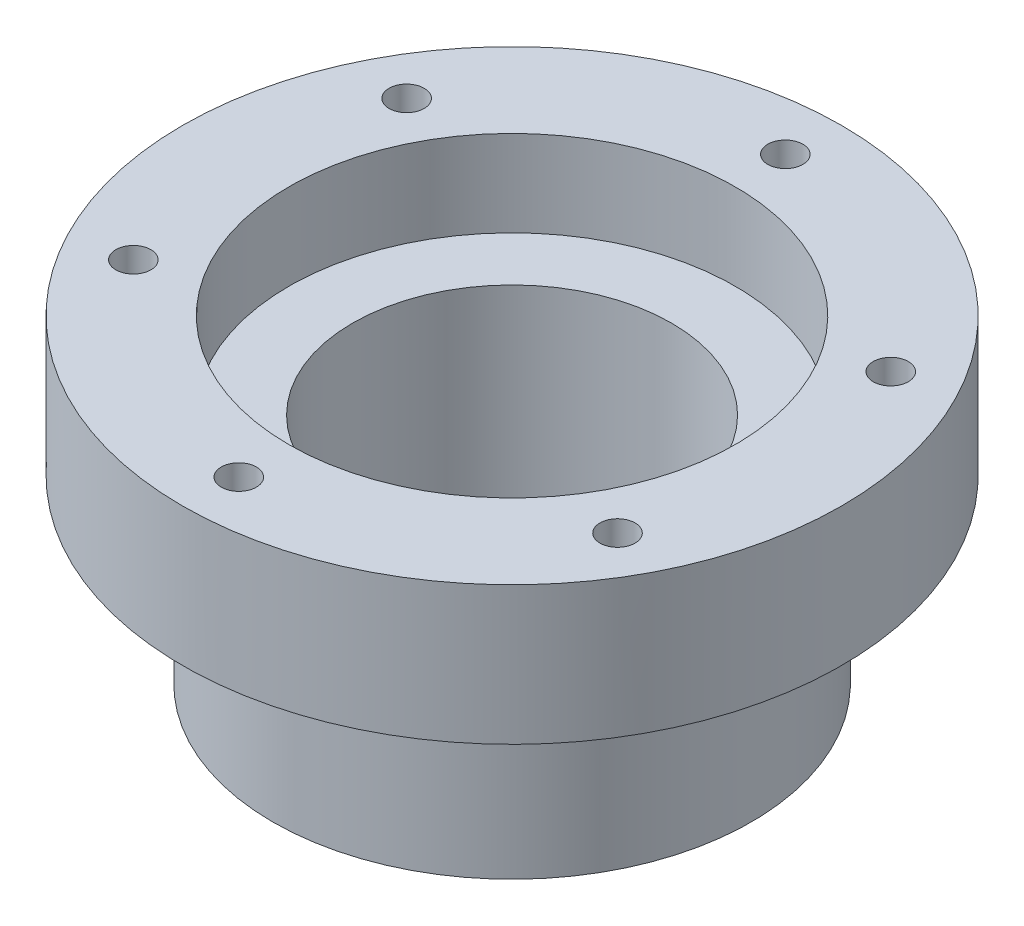
ISO-10303-21;
HEADER;
FILE_DESCRIPTION(('STEP AP214'),'2;1');
FILE_NAME('part.step','',(''),(''),'','','');
FILE_SCHEMA(('AUTOMOTIVE_DESIGN { 1 0 10303 214 1 1 1 1 }'));
ENDSEC;
DATA;
#1=APPLICATION_CONTEXT('core data for automotive mechanical design processes');
#2=APPLICATION_PROTOCOL_DEFINITION('international standard','automotive_design',2000,#1);
#3=PRODUCT_CONTEXT('',#1,'mechanical');
#4=PRODUCT('Part','Part','',(#3));
#5=PRODUCT_RELATED_PRODUCT_CATEGORY('part','',(#4));
#6=PRODUCT_DEFINITION_FORMATION('','',#4);
#7=PRODUCT_DEFINITION_CONTEXT('part definition',#1,'design');
#8=PRODUCT_DEFINITION('design','',#6,#7);
#9=PRODUCT_DEFINITION_SHAPE('','',#8);
#10=(LENGTH_UNIT() NAMED_UNIT(*) SI_UNIT(.MILLI.,.METRE.));
#11=(NAMED_UNIT(*) PLANE_ANGLE_UNIT() SI_UNIT($,.RADIAN.));
#12=(NAMED_UNIT(*) SI_UNIT($,.STERADIAN.) SOLID_ANGLE_UNIT());
#13=UNCERTAINTY_MEASURE_WITH_UNIT(LENGTH_MEASURE(1.E-05),#10,'distance_accuracy_value','');
#14=(GEOMETRIC_REPRESENTATION_CONTEXT(3) GLOBAL_UNCERTAINTY_ASSIGNED_CONTEXT((#13)) GLOBAL_UNIT_ASSIGNED_CONTEXT((#10,
#11,#12)) REPRESENTATION_CONTEXT('',''));
#15=CARTESIAN_POINT('',(0.,0.,0.));
#16=DIRECTION('',(0.,0.,1.));
#17=DIRECTION('',(1.,0.,0.));
#18=AXIS2_PLACEMENT_3D('',#15,#16,#17);
#19=CARTESIAN_POINT('',(0.,30.,0.));
#20=DIRECTION('',(0.,-1.,0.));
#21=DIRECTION('',(0.,0.,-1.));
#22=AXIS2_PLACEMENT_3D('',#19,#20,#21);
#23=CYLINDRICAL_SURFACE('',#22,15.);
#24=CARTESIAN_POINT('',(0.,0.,0.));
#25=DIRECTION('',(0.,-1.,0.));
#26=DIRECTION('',(0.,0.,-1.));
#27=AXIS2_PLACEMENT_3D('',#24,#25,#26);
#28=CIRCLE('',#27,15.);
#29=CARTESIAN_POINT('',(0.,0.,-15.));
#30=VERTEX_POINT('',#29);
#31=EDGE_CURVE('E82',#30,#30,#28,.T.);
#32=ORIENTED_EDGE('',*,*,#31,.T.);
#33=EDGE_LOOP('',(#32));
#34=FACE_BOUND('',#33,.T.);
#35=CARTESIAN_POINT('',(0.,21.9,0.));
#36=DIRECTION('',(0.,1.,0.));
#37=DIRECTION('',(0.,0.,1.));
#38=AXIS2_PLACEMENT_3D('',#35,#36,#37);
#39=CIRCLE('',#38,15.);
#40=CARTESIAN_POINT('',(0.,21.9,15.));
#41=VERTEX_POINT('',#40);
#42=EDGE_CURVE('E80',#41,#41,#39,.F.);
#43=ORIENTED_EDGE('',*,*,#42,.F.);
#44=EDGE_LOOP('',(#43));
#45=FACE_BOUND('',#44,.T.);
#46=ADVANCED_FACE('F41',(#34,#45),#23,.F.);
#47=CARTESIAN_POINT('',(0.,30.,0.));
#48=DIRECTION('',(0.,-1.,0.));
#49=DIRECTION('',(0.,0.,-1.));
#50=AXIS2_PLACEMENT_3D('',#47,#48,#49);
#51=CYLINDRICAL_SURFACE('',#50,31.);
#52=CARTESIAN_POINT('',(0.,30.,0.));
#53=DIRECTION('',(0.,1.,0.));
#54=DIRECTION('',(0.,0.,1.));
#55=AXIS2_PLACEMENT_3D('',#52,#53,#54);
#56=CIRCLE('',#55,31.);
#57=CARTESIAN_POINT('',(0.,30.,31.));
#58=VERTEX_POINT('',#57);
#59=EDGE_CURVE('E52',#58,#58,#56,.T.);
#60=ORIENTED_EDGE('',*,*,#59,.F.);
#61=EDGE_LOOP('',(#60));
#62=FACE_BOUND('',#61,.T.);
#63=CARTESIAN_POINT('',(0.,17.,0.));
#64=DIRECTION('',(0.,-1.,0.));
#65=DIRECTION('',(0.,0.,-1.));
#66=AXIS2_PLACEMENT_3D('',#63,#64,#65);
#67=CIRCLE('',#66,31.);
#68=CARTESIAN_POINT('',(0.,17.,-31.));
#69=VERTEX_POINT('',#68);
#70=EDGE_CURVE('E56',#69,#69,#67,.T.);
#71=ORIENTED_EDGE('',*,*,#70,.F.);
#72=EDGE_LOOP('',(#71));
#73=FACE_BOUND('',#72,.T.);
#74=ADVANCED_FACE('F119',(#62,#73),#51,.T.);
#75=CARTESIAN_POINT('',(0.,30.,0.));
#76=DIRECTION('',(0.,1.,0.));
#77=DIRECTION('',(0.,0.,1.));
#78=AXIS2_PLACEMENT_3D('',#75,#76,#77);
#79=PLANE('',#78);
#80=CARTESIAN_POINT('',(-0.294790253529101,30.,-25.9983287675655));
#81=DIRECTION('',(0.,1.,0.));
#82=DIRECTION('',(0.,0.,1.));
#83=AXIS2_PLACEMENT_3D('',#80,#81,#82);
#84=CIRCLE('',#83,1.65);
#85=CARTESIAN_POINT('',(-0.294790253529101,30.,-24.3483287675655));
#86=VERTEX_POINT('',#85);
#87=EDGE_CURVE('E63',#86,#86,#84,.T.);
#88=ORIENTED_EDGE('',*,*,#87,.F.);
#89=EDGE_LOOP('',(#88));
#90=FACE_BOUND('',#89,.T.);
#91=CARTESIAN_POINT('',(22.3678180418876,30.,-13.2544602321281));
#92=DIRECTION('',(0.,1.,0.));
#93=DIRECTION('',(0.,0.,1.));
#94=AXIS2_PLACEMENT_3D('',#91,#92,#93);
#95=CIRCLE('',#94,1.65);
#96=CARTESIAN_POINT('',(22.3678180418876,30.,-11.6044602321281));
#97=VERTEX_POINT('',#96);
#98=EDGE_CURVE('E62',#97,#97,#95,.T.);
#99=ORIENTED_EDGE('',*,*,#98,.F.);
#100=EDGE_LOOP('',(#99));
#101=FACE_BOUND('',#100,.T.);
#102=CARTESIAN_POINT('',(22.662608295418,30.,12.7438685354374));
#103=DIRECTION('',(0.,1.,0.));
#104=DIRECTION('',(0.,0.,1.));
#105=AXIS2_PLACEMENT_3D('',#102,#103,#104);
#106=CIRCLE('',#105,1.65);
#107=CARTESIAN_POINT('',(22.662608295418,30.,14.3938685354374));
#108=VERTEX_POINT('',#107);
#109=EDGE_CURVE('E67',#108,#108,#106,.T.);
#110=ORIENTED_EDGE('',*,*,#109,.F.);
#111=EDGE_LOOP('',(#110));
#112=FACE_BOUND('',#111,.T.);
#113=CARTESIAN_POINT('',(0.294790253531648,30.,25.9983287675655));
#114=DIRECTION('',(0.,1.,0.));
#115=DIRECTION('',(0.,0.,1.));
#116=AXIS2_PLACEMENT_3D('',#113,#114,#115);
#117=CIRCLE('',#116,1.65);
#118=CARTESIAN_POINT('',(0.294790253531648,30.,27.6483287675655));
#119=VERTEX_POINT('',#118);
#120=EDGE_CURVE('E71',#119,#119,#117,.T.);
#121=ORIENTED_EDGE('',*,*,#120,.F.);
#122=EDGE_LOOP('',(#121));
#123=FACE_BOUND('',#122,.T.);
#124=CARTESIAN_POINT('',(-22.367818041885,30.,13.2544602321281));
#125=DIRECTION('',(0.,1.,0.));
#126=DIRECTION('',(0.,0.,1.));
#127=AXIS2_PLACEMENT_3D('',#124,#125,#126);
#128=CIRCLE('',#127,1.65);
#129=CARTESIAN_POINT('',(-22.367818041885,30.,14.9044602321281));
#130=VERTEX_POINT('',#129);
#131=EDGE_CURVE('E75',#130,#130,#128,.T.);
#132=ORIENTED_EDGE('',*,*,#131,.F.);
#133=EDGE_LOOP('',(#132));
#134=FACE_BOUND('',#133,.T.);
#135=CARTESIAN_POINT('',(-22.6626082954154,30.,-12.7438685354374));
#136=DIRECTION('',(0.,1.,0.));
#137=DIRECTION('',(0.,0.,1.));
#138=AXIS2_PLACEMENT_3D('',#135,#136,#137);
#139=CIRCLE('',#138,1.65);
#140=CARTESIAN_POINT('',(-22.6626082954154,30.,-11.0938685354374));
#141=VERTEX_POINT('',#140);
#142=EDGE_CURVE('E79',#141,#141,#139,.T.);
#143=ORIENTED_EDGE('',*,*,#142,.F.);
#144=EDGE_LOOP('',(#143));
#145=FACE_BOUND('',#144,.T.);
#146=CARTESIAN_POINT('',(0.,30.,0.));
#147=DIRECTION('',(0.,1.,0.));
#148=DIRECTION('',(0.,0.,1.));
#149=AXIS2_PLACEMENT_3D('',#146,#147,#148);
#150=CIRCLE('',#149,21.);
#151=CARTESIAN_POINT('',(0.,30.,21.));
#152=VERTEX_POINT('',#151);
#153=EDGE_CURVE('E92',#152,#152,#150,.T.);
#154=ORIENTED_EDGE('',*,*,#153,.F.);
#155=EDGE_LOOP('',(#154));
#156=FACE_BOUND('',#155,.T.);
#157=ORIENTED_EDGE('',*,*,#59,.T.);
#158=EDGE_LOOP('',(#157));
#159=FACE_BOUND('',#158,.T.);
#160=ADVANCED_FACE('F115',(#90,#101,#112,#123,#134,#145,#156,#159),#79,.T.);
#161=CARTESIAN_POINT('',(0.,17.,0.));
#162=DIRECTION('',(0.,-1.,0.));
#163=DIRECTION('',(0.,0.,-1.));
#164=AXIS2_PLACEMENT_3D('',#161,#162,#163);
#165=CYLINDRICAL_SURFACE('',#164,22.5);
#166=CARTESIAN_POINT('',(0.,16.,0.));
#167=DIRECTION('',(0.,-1.,0.));
#168=DIRECTION('',(0.,0.,-1.));
#169=AXIS2_PLACEMENT_3D('',#166,#167,#168);
#170=CIRCLE('',#169,22.5);
#171=CARTESIAN_POINT('',(0.,16.,-22.5));
#172=VERTEX_POINT('',#171);
#173=EDGE_CURVE('E48',#172,#172,#170,.T.);
#174=ORIENTED_EDGE('',*,*,#173,.T.);
#175=EDGE_LOOP('',(#174));
#176=FACE_BOUND('',#175,.T.);
#177=CARTESIAN_POINT('',(0.,0.,0.));
#178=DIRECTION('',(0.,-1.,0.));
#179=DIRECTION('',(0.,0.,-1.));
#180=AXIS2_PLACEMENT_3D('',#177,#178,#179);
#181=CIRCLE('',#180,22.5);
#182=CARTESIAN_POINT('',(0.,0.,-22.5));
#183=VERTEX_POINT('',#182);
#184=EDGE_CURVE('E85',#183,#183,#181,.T.);
#185=ORIENTED_EDGE('',*,*,#184,.F.);
#186=EDGE_LOOP('',(#185));
#187=FACE_BOUND('',#186,.T.);
#188=ADVANCED_FACE('F118',(#176,#187),#165,.T.);
#189=CARTESIAN_POINT('',(0.,17.,0.));
#190=DIRECTION('',(0.,-1.,0.));
#191=DIRECTION('',(0.,0.,-1.));
#192=AXIS2_PLACEMENT_3D('',#189,#190,#191);
#193=PLANE('',#192);
#194=CARTESIAN_POINT('',(0.,17.,0.));
#195=DIRECTION('',(0.,-1.,0.));
#196=DIRECTION('',(0.,0.,-1.));
#197=AXIS2_PLACEMENT_3D('',#194,#195,#196);
#198=CIRCLE('',#197,23.5);
#199=CARTESIAN_POINT('',(0.,17.,-23.5));
#200=VERTEX_POINT('',#199);
#201=EDGE_CURVE('E10',#200,#200,#198,.F.);
#202=ORIENTED_EDGE('',*,*,#201,.T.);
#203=EDGE_LOOP('',(#202));
#204=FACE_BOUND('',#203,.T.);
#205=CARTESIAN_POINT('',(-0.294790253529101,17.,-25.9983287675655));
#206=DIRECTION('',(0.,-1.,0.));
#207=DIRECTION('',(0.,0.,-1.));
#208=AXIS2_PLACEMENT_3D('',#205,#206,#207);
#209=CIRCLE('',#208,1.64999999999999);
#210=CARTESIAN_POINT('',(-0.294790253529101,17.,-27.6483287675655));
#211=VERTEX_POINT('',#210);
#212=EDGE_CURVE('E59',#211,#211,#209,.T.);
#213=ORIENTED_EDGE('',*,*,#212,.F.);
#214=EDGE_LOOP('',(#213));
#215=FACE_BOUND('',#214,.T.);
#216=CARTESIAN_POINT('',(22.3678180418876,17.,-13.2544602321281));
#217=DIRECTION('',(0.,-1.,0.));
#218=DIRECTION('',(0.,0.,-1.));
#219=AXIS2_PLACEMENT_3D('',#216,#217,#218);
#220=CIRCLE('',#219,1.64999999999999);
#221=CARTESIAN_POINT('',(22.3678180418876,17.,-14.9044602321281));
#222=VERTEX_POINT('',#221);
#223=EDGE_CURVE('E64',#222,#222,#220,.T.);
#224=ORIENTED_EDGE('',*,*,#223,.F.);
#225=EDGE_LOOP('',(#224));
#226=FACE_BOUND('',#225,.T.);
#227=CARTESIAN_POINT('',(22.662608295418,17.,12.7438685354374));
#228=DIRECTION('',(0.,-1.,0.));
#229=DIRECTION('',(0.,0.,-1.));
#230=AXIS2_PLACEMENT_3D('',#227,#228,#229);
#231=CIRCLE('',#230,1.64999999999999);
#232=CARTESIAN_POINT('',(22.662608295418,17.,11.0938685354374));
#233=VERTEX_POINT('',#232);
#234=EDGE_CURVE('E68',#233,#233,#231,.T.);
#235=ORIENTED_EDGE('',*,*,#234,.F.);
#236=EDGE_LOOP('',(#235));
#237=FACE_BOUND('',#236,.T.);
#238=CARTESIAN_POINT('',(0.294790253531648,17.,25.9983287675655));
#239=DIRECTION('',(0.,-1.,0.));
#240=DIRECTION('',(0.,0.,-1.));
#241=AXIS2_PLACEMENT_3D('',#238,#239,#240);
#242=CIRCLE('',#241,1.64999999999999);
#243=CARTESIAN_POINT('',(0.294790253531648,17.,24.3483287675655));
#244=VERTEX_POINT('',#243);
#245=EDGE_CURVE('E72',#244,#244,#242,.T.);
#246=ORIENTED_EDGE('',*,*,#245,.F.);
#247=EDGE_LOOP('',(#246));
#248=FACE_BOUND('',#247,.T.);
#249=CARTESIAN_POINT('',(-22.367818041885,17.,13.2544602321281));
#250=DIRECTION('',(0.,-1.,0.));
#251=DIRECTION('',(0.,0.,-1.));
#252=AXIS2_PLACEMENT_3D('',#249,#250,#251);
#253=CIRCLE('',#252,1.64999999999999);
#254=CARTESIAN_POINT('',(-22.367818041885,17.,11.6044602321281));
#255=VERTEX_POINT('',#254);
#256=EDGE_CURVE('E76',#255,#255,#253,.T.);
#257=ORIENTED_EDGE('',*,*,#256,.F.);
#258=EDGE_LOOP('',(#257));
#259=FACE_BOUND('',#258,.T.);
#260=CARTESIAN_POINT('',(-22.6626082954154,17.,-12.7438685354374));
#261=DIRECTION('',(0.,-1.,0.));
#262=DIRECTION('',(0.,0.,-1.));
#263=AXIS2_PLACEMENT_3D('',#260,#261,#262);
#264=CIRCLE('',#263,1.64999999999999);
#265=CARTESIAN_POINT('',(-22.6626082954154,17.,-14.3938685354374));
#266=VERTEX_POINT('',#265);
#267=EDGE_CURVE('E95',#266,#266,#264,.T.);
#268=ORIENTED_EDGE('',*,*,#267,.F.);
#269=EDGE_LOOP('',(#268));
#270=FACE_BOUND('',#269,.T.);
#271=ORIENTED_EDGE('',*,*,#70,.T.);
#272=EDGE_LOOP('',(#271));
#273=FACE_BOUND('',#272,.T.);
#274=ADVANCED_FACE('F139',(#204,#215,#226,#237,#248,#259,#270,#273),#193,.T.);
#275=CARTESIAN_POINT('',(0.,0.,0.));
#276=DIRECTION('',(0.,1.,0.));
#277=DIRECTION('',(0.,0.,1.));
#278=AXIS2_PLACEMENT_3D('',#275,#276,#277);
#279=PLANE('',#278);
#280=ORIENTED_EDGE('',*,*,#31,.F.);
#281=EDGE_LOOP('',(#280));
#282=FACE_BOUND('',#281,.T.);
#283=ORIENTED_EDGE('',*,*,#184,.T.);
#284=EDGE_LOOP('',(#283));
#285=FACE_BOUND('',#284,.T.);
#286=ADVANCED_FACE('F141',(#282,#285),#279,.F.);
#287=CARTESIAN_POINT('',(0.,21.9,0.));
#288=DIRECTION('',(0.,1.,0.));
#289=DIRECTION('',(0.,0.,1.));
#290=AXIS2_PLACEMENT_3D('',#287,#288,#289);
#291=PLANE('',#290);
#292=CARTESIAN_POINT('',(0.,21.9,0.));
#293=DIRECTION('',(0.,1.,0.));
#294=DIRECTION('',(0.,0.,1.));
#295=AXIS2_PLACEMENT_3D('',#292,#293,#294);
#296=CIRCLE('',#295,21.);
#297=CARTESIAN_POINT('',(0.,21.9,21.));
#298=VERTEX_POINT('',#297);
#299=EDGE_CURVE('E83',#298,#298,#296,.T.);
#300=ORIENTED_EDGE('',*,*,#299,.T.);
#301=EDGE_LOOP('',(#300));
#302=FACE_BOUND('',#301,.T.);
#303=ORIENTED_EDGE('',*,*,#42,.T.);
#304=EDGE_LOOP('',(#303));
#305=FACE_BOUND('',#304,.T.);
#306=ADVANCED_FACE('F147',(#302,#305),#291,.T.);
#307=CARTESIAN_POINT('',(0.,21.9,0.));
#308=DIRECTION('',(0.,1.,0.));
#309=DIRECTION('',(0.,0.,1.));
#310=AXIS2_PLACEMENT_3D('',#307,#308,#309);
#311=CYLINDRICAL_SURFACE('',#310,21.);
#312=ORIENTED_EDGE('',*,*,#299,.F.);
#313=EDGE_LOOP('',(#312));
#314=FACE_BOUND('',#313,.T.);
#315=ORIENTED_EDGE('',*,*,#153,.T.);
#316=EDGE_LOOP('',(#315));
#317=FACE_BOUND('',#316,.T.);
#318=ADVANCED_FACE('F159',(#314,#317),#311,.F.);
#319=CARTESIAN_POINT('',(-22.6626082954154,30.,-12.7438685354374));
#320=DIRECTION('',(0.,1.,0.));
#321=DIRECTION('',(0.,0.,1.));
#322=AXIS2_PLACEMENT_3D('',#319,#320,#321);
#323=CYLINDRICAL_SURFACE('',#322,1.64999999999999);
#324=ORIENTED_EDGE('',*,*,#267,.T.);
#325=EDGE_LOOP('',(#324));
#326=FACE_BOUND('',#325,.T.);
#327=ORIENTED_EDGE('',*,*,#142,.T.);
#328=EDGE_LOOP('',(#327));
#329=FACE_BOUND('',#328,.T.);
#330=ADVANCED_FACE('F162',(#326,#329),#323,.F.);
#331=CARTESIAN_POINT('',(-22.367818041885,30.,13.2544602321281));
#332=DIRECTION('',(0.,1.,0.));
#333=DIRECTION('',(0.,0.,1.));
#334=AXIS2_PLACEMENT_3D('',#331,#332,#333);
#335=CYLINDRICAL_SURFACE('',#334,1.64999999999999);
#336=ORIENTED_EDGE('',*,*,#256,.T.);
#337=EDGE_LOOP('',(#336));
#338=FACE_BOUND('',#337,.T.);
#339=ORIENTED_EDGE('',*,*,#131,.T.);
#340=EDGE_LOOP('',(#339));
#341=FACE_BOUND('',#340,.T.);
#342=ADVANCED_FACE('F169',(#338,#341),#335,.F.);
#343=CARTESIAN_POINT('',(0.294790253531648,30.,25.9983287675655));
#344=DIRECTION('',(0.,1.,0.));
#345=DIRECTION('',(0.,0.,1.));
#346=AXIS2_PLACEMENT_3D('',#343,#344,#345);
#347=CYLINDRICAL_SURFACE('',#346,1.64999999999999);
#348=ORIENTED_EDGE('',*,*,#245,.T.);
#349=EDGE_LOOP('',(#348));
#350=FACE_BOUND('',#349,.T.);
#351=ORIENTED_EDGE('',*,*,#120,.T.);
#352=EDGE_LOOP('',(#351));
#353=FACE_BOUND('',#352,.T.);
#354=ADVANCED_FACE('F173',(#350,#353),#347,.F.);
#355=CARTESIAN_POINT('',(22.662608295418,30.,12.7438685354374));
#356=DIRECTION('',(0.,1.,0.));
#357=DIRECTION('',(0.,0.,1.));
#358=AXIS2_PLACEMENT_3D('',#355,#356,#357);
#359=CYLINDRICAL_SURFACE('',#358,1.64999999999999);
#360=ORIENTED_EDGE('',*,*,#234,.T.);
#361=EDGE_LOOP('',(#360));
#362=FACE_BOUND('',#361,.T.);
#363=ORIENTED_EDGE('',*,*,#109,.T.);
#364=EDGE_LOOP('',(#363));
#365=FACE_BOUND('',#364,.T.);
#366=ADVANCED_FACE('F177',(#362,#365),#359,.F.);
#367=CARTESIAN_POINT('',(22.3678180418876,30.,-13.2544602321281));
#368=DIRECTION('',(0.,1.,0.));
#369=DIRECTION('',(0.,0.,1.));
#370=AXIS2_PLACEMENT_3D('',#367,#368,#369);
#371=CYLINDRICAL_SURFACE('',#370,1.64999999999999);
#372=ORIENTED_EDGE('',*,*,#223,.T.);
#373=EDGE_LOOP('',(#372));
#374=FACE_BOUND('',#373,.T.);
#375=ORIENTED_EDGE('',*,*,#98,.T.);
#376=EDGE_LOOP('',(#375));
#377=FACE_BOUND('',#376,.T.);
#378=ADVANCED_FACE('F181',(#374,#377),#371,.F.);
#379=CARTESIAN_POINT('',(-0.294790253529101,30.,-25.9983287675655));
#380=DIRECTION('',(0.,1.,0.));
#381=DIRECTION('',(0.,0.,1.));
#382=AXIS2_PLACEMENT_3D('',#379,#380,#381);
#383=CYLINDRICAL_SURFACE('',#382,1.64999999999999);
#384=ORIENTED_EDGE('',*,*,#212,.T.);
#385=EDGE_LOOP('',(#384));
#386=FACE_BOUND('',#385,.T.);
#387=ORIENTED_EDGE('',*,*,#87,.T.);
#388=EDGE_LOOP('',(#387));
#389=FACE_BOUND('',#388,.T.);
#390=ADVANCED_FACE('F113',(#386,#389),#383,.F.);
#391=CARTESIAN_POINT('',(0.,16.,0.));
#392=DIRECTION('',(0.,-1.,0.));
#393=DIRECTION('',(0.,0.,-1.));
#394=AXIS2_PLACEMENT_3D('',#391,#392,#393);
#395=TOROIDAL_SURFACE('',#394,23.5,1.);
#396=ORIENTED_EDGE('',*,*,#201,.F.);
#397=EDGE_LOOP('',(#396));
#398=FACE_BOUND('',#397,.T.);
#399=ORIENTED_EDGE('',*,*,#173,.F.);
#400=EDGE_LOOP('',(#399));
#401=FACE_BOUND('',#400,.T.);
#402=ADVANCED_FACE('F43',(#398,#401),#395,.F.);
#403=CLOSED_SHELL('',(#46,#74,#160,#188,#274,#286,#306,#318,#330,#342,#354,#366,#378,#390,#402));
#404=MANIFOLD_SOLID_BREP('B2',#403);
#405=ADVANCED_BREP_SHAPE_REPRESENTATION('',(#18,#404),#14);
#406=SHAPE_DEFINITION_REPRESENTATION(#9,#405);
ENDSEC;
END-ISO-10303-21;
